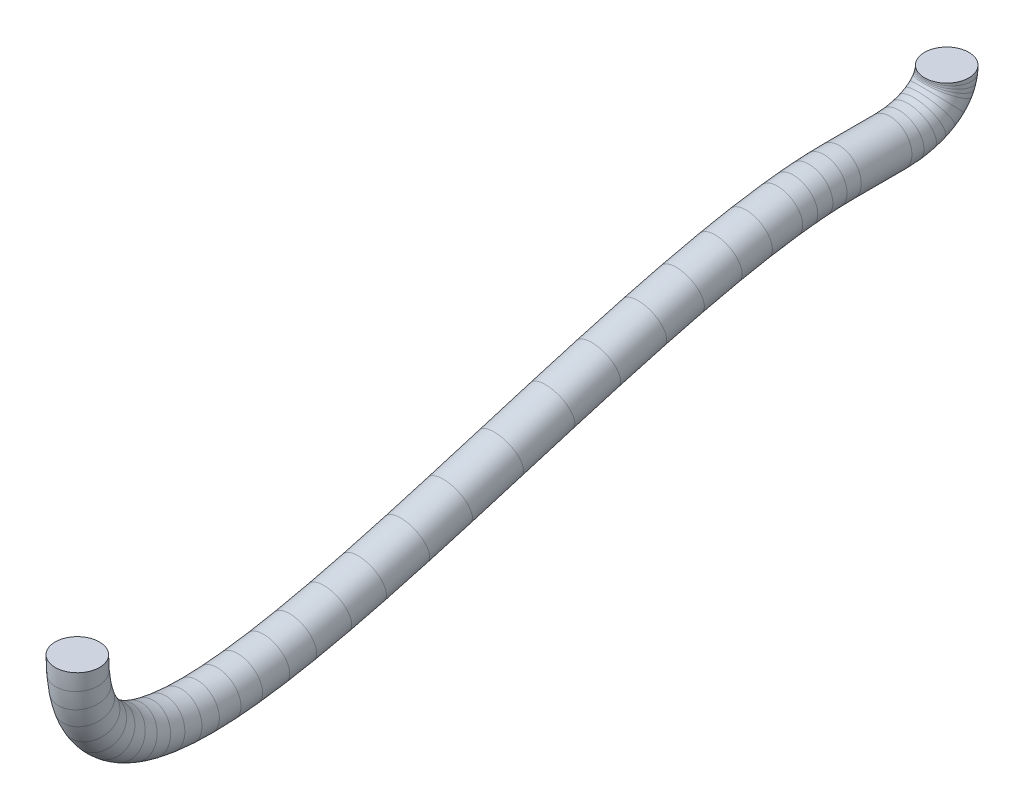
ISO-10303-21;
HEADER;
FILE_DESCRIPTION(('STEP AP214'),'2;1');
FILE_NAME('part.step','',(''),(''),'','','');
FILE_SCHEMA(('AUTOMOTIVE_DESIGN { 1 0 10303 214 1 1 1 1 }'));
ENDSEC;
DATA;
#1=APPLICATION_CONTEXT('core data for automotive mechanical design processes');
#2=APPLICATION_PROTOCOL_DEFINITION('international standard','automotive_design',2000,#1);
#3=PRODUCT_CONTEXT('',#1,'mechanical');
#4=PRODUCT('Part','Part','',(#3));
#5=PRODUCT_RELATED_PRODUCT_CATEGORY('part','',(#4));
#6=PRODUCT_DEFINITION_FORMATION('','',#4);
#7=PRODUCT_DEFINITION_CONTEXT('part definition',#1,'design');
#8=PRODUCT_DEFINITION('design','',#6,#7);
#9=PRODUCT_DEFINITION_SHAPE('','',#8);
#10=(LENGTH_UNIT() NAMED_UNIT(*) SI_UNIT(.MILLI.,.METRE.));
#11=(NAMED_UNIT(*) PLANE_ANGLE_UNIT() SI_UNIT($,.RADIAN.));
#12=(NAMED_UNIT(*) SI_UNIT($,.STERADIAN.) SOLID_ANGLE_UNIT());
#13=UNCERTAINTY_MEASURE_WITH_UNIT(LENGTH_MEASURE(1.E-05),#10,'distance_accuracy_value','');
#14=(GEOMETRIC_REPRESENTATION_CONTEXT(3) GLOBAL_UNCERTAINTY_ASSIGNED_CONTEXT((#13)) GLOBAL_UNIT_ASSIGNED_CONTEXT((#10,
#11,#12)) REPRESENTATION_CONTEXT('',''));
#15=CARTESIAN_POINT('',(0.,0.,0.));
#16=DIRECTION('',(0.,0.,1.));
#17=DIRECTION('',(1.,0.,0.));
#18=AXIS2_PLACEMENT_3D('',#15,#16,#17);
#19=CARTESIAN_POINT('',(-4.25000000000187,-230.95,225.510489149716));
#20=DIRECTION('',(0.,-1.,0.));
#21=DIRECTION('',(0.,0.,-1.));
#22=AXIS2_PLACEMENT_3D('',#19,#20,#21);
#23=PLANE('',#22);
#24=CARTESIAN_POINT('',(-4.25000000000187,-230.95,225.510489149716));
#25=DIRECTION('',(0.,1.,0.));
#26=DIRECTION('',(0.,0.,-1.));
#27=AXIS2_PLACEMENT_3D('',#24,#25,#26);
#28=CIRCLE('',#27,1.75);
#29=CARTESIAN_POINT('',(-4.25000000000187,-230.95,223.760489149716));
#30=VERTEX_POINT('',#29);
#31=EDGE_CURVE('E11',#30,#30,#28,.T.);
#32=ORIENTED_EDGE('',*,*,#31,.T.);
#33=EDGE_LOOP('',(#32));
#34=FACE_BOUND('',#33,.T.);
#35=ADVANCED_FACE('F42',(#34),#23,.F.);
#36=CARTESIAN_POINT('',(-4.25000000000187,-230.949999999997,211.445704661822));
#37=DIRECTION('',(1.,0.,0.));
#38=DIRECTION('',(0.,0.,1.));
#39=AXIS2_PLACEMENT_3D('',#36,#37,#38);
#40=TOROIDAL_SURFACE('',#39,14.0647844878944,1.75);
#41=ORIENTED_EDGE('',*,*,#31,.F.);
#42=EDGE_LOOP('',(#41));
#43=FACE_BOUND('',#42,.T.);
#44=CARTESIAN_POINT('',(-4.25000000000187,-232.154264746609,225.458838112659));
#45=DIRECTION('',(0.,0.996327633949824,0.0856226945847067));
#46=DIRECTION('',(0.,0.0856226945847067,-0.996327633949824));
#47=AXIS2_PLACEMENT_3D('',#44,#45,#46);
#48=CIRCLE('',#47,1.75);
#49=CARTESIAN_POINT('',(-4.25000000000187,-232.004425031085,223.715264753247));
#50=VERTEX_POINT('',#49);
#51=EDGE_CURVE('E53',#50,#50,#48,.T.);
#52=ORIENTED_EDGE('',*,*,#51,.T.);
#53=EDGE_LOOP('',(#52));
#54=FACE_BOUND('',#53,.T.);
#55=ADVANCED_FACE('F242',(#43,#54),#40,.T.);
#56=CARTESIAN_POINT('',(-4.25000000000199,-231.277167470841,215.252709261574));
#57=DIRECTION('',(-1.,0.,0.));
#58=DIRECTION('',(0.,0.,-1.));
#59=AXIS2_PLACEMENT_3D('',#56,#57,#58);
#60=TOROIDAL_SURFACE('',#59,10.2437476421527,1.75);
#61=CARTESIAN_POINT('',(-4.25000000000187,-233.346097740136,225.285350653397));
#62=DIRECTION('',(0.,0.97939169748172,0.20197005447312));
#63=DIRECTION('',(0.,0.20197005447312,-0.97939169748172));
#64=AXIS2_PLACEMENT_3D('',#61,#62,#63);
#65=CIRCLE('',#64,1.75);
#66=CARTESIAN_POINT('',(-4.25000000000187,-232.992650144808,223.571415182803));
#67=VERTEX_POINT('',#66);
#68=EDGE_CURVE('E208',#67,#67,#65,.T.);
#69=ORIENTED_EDGE('',*,*,#68,.T.);
#70=EDGE_LOOP('',(#69));
#71=FACE_BOUND('',#70,.T.);
#72=ORIENTED_EDGE('',*,*,#51,.F.);
#73=EDGE_LOOP('',(#72));
#74=FACE_BOUND('',#73,.T.);
#75=ADVANCED_FACE('F247',(#71,#74),#60,.T.);
#76=CARTESIAN_POINT('',(-4.25000000000187,-231.584241722187,216.741771454796));
#77=DIRECTION('',(-1.,0.,0.));
#78=DIRECTION('',(0.,1.,0.));
#79=AXIS2_PLACEMENT_3D('',#76,#77,#78);
#80=TOROIDAL_SURFACE('',#79,8.72335268980548,1.75);
#81=CARTESIAN_POINT('',(-4.25000000000187,-234.503096325618,224.962304889723));
#82=DIRECTION('',(0.,0.942359403229759,0.334602383650285));
#83=DIRECTION('',(0.,0.334602383650285,-0.942359403229759));
#84=AXIS2_PLACEMENT_3D('',#81,#82,#83);
#85=CIRCLE('',#84,1.75);
#86=CARTESIAN_POINT('',(-4.25000000000186,-233.91754215423,223.313175934071));
#87=VERTEX_POINT('',#86);
#88=EDGE_CURVE('E141',#87,#87,#85,.T.);
#89=ORIENTED_EDGE('',*,*,#88,.T.);
#90=EDGE_LOOP('',(#89));
#91=FACE_BOUND('',#90,.T.);
#92=ORIENTED_EDGE('',*,*,#68,.F.);
#93=EDGE_LOOP('',(#92));
#94=FACE_BOUND('',#93,.T.);
#95=ADVANCED_FACE('F411',(#91,#94),#80,.T.);
#96=CARTESIAN_POINT('',(-4.25000000000192,-232.255156456802,218.631306137818));
#97=DIRECTION('',(-1.,0.,0.));
#98=DIRECTION('',(0.,0.,-1.));
#99=AXIS2_PLACEMENT_3D('',#96,#97,#98);
#100=TOROIDAL_SURFACE('',#99,6.71824224410275,1.75);
#101=CARTESIAN_POINT('',(-4.25000000000187,-235.592941489095,224.461740935381));
#102=DIRECTION('',(0.,0.867851230384199,0.496824155935107));
#103=DIRECTION('',(0.,0.496824155935107,-0.867851230384199));
#104=AXIS2_PLACEMENT_3D('',#101,#102,#103);
#105=CIRCLE('',#104,1.75);
#106=CARTESIAN_POINT('',(-4.25000000000187,-234.723499216209,222.943001282209));
#107=VERTEX_POINT('',#106);
#108=EDGE_CURVE('E133',#107,#107,#105,.T.);
#109=ORIENTED_EDGE('',*,*,#108,.T.);
#110=EDGE_LOOP('',(#109));
#111=FACE_BOUND('',#110,.T.);
#112=ORIENTED_EDGE('',*,*,#88,.F.);
#113=EDGE_LOOP('',(#112));
#114=FACE_BOUND('',#113,.T.);
#115=ADVANCED_FACE('F413',(#111,#114),#100,.T.);
#116=CARTESIAN_POINT('',(-4.25000000000187,-232.535257527852,219.120586009259));
#117=DIRECTION('',(-1.,0.,0.));
#118=DIRECTION('',(0.,1.,0.));
#119=AXIS2_PLACEMENT_3D('',#116,#117,#118);
#120=TOROIDAL_SURFACE('',#119,6.15445912746987,1.75);
#121=CARTESIAN_POINT('',(-4.25000000000188,-236.504884638056,223.823715579836));
#122=DIRECTION('',(0.,0.76418243637133,0.645000158094227));
#123=DIRECTION('',(0.,0.645000158094227,-0.76418243637133));
#124=AXIS2_PLACEMENT_3D('',#121,#122,#123);
#125=CIRCLE('',#124,1.75);
#126=CARTESIAN_POINT('',(-4.25000000000187,-235.376134361391,222.486396316186));
#127=VERTEX_POINT('',#126);
#128=EDGE_CURVE('E46',#127,#127,#125,.T.);
#129=ORIENTED_EDGE('',*,*,#128,.T.);
#130=EDGE_LOOP('',(#129));
#131=FACE_BOUND('',#130,.T.);
#132=ORIENTED_EDGE('',*,*,#108,.F.);
#133=EDGE_LOOP('',(#132));
#134=FACE_BOUND('',#133,.T.);
#135=ADVANCED_FACE('F44',(#131,#134),#120,.T.);
#136=CARTESIAN_POINT('',(-4.25000000000193,-232.617301362329,219.217789795226));
#137=DIRECTION('',(-1.,0.,0.));
#138=DIRECTION('',(0.,0.,-1.));
#139=AXIS2_PLACEMENT_3D('',#136,#137,#138);
#140=TOROIDAL_SURFACE('',#139,6.02725941527647,1.75);
#141=CARTESIAN_POINT('',(-4.25000000000188,-237.285365654283,223.030535764369));
#142=DIRECTION('',(0.,0.632583684630803,0.774492015413276));
#143=DIRECTION('',(0.,0.774492015413276,-0.632583684630802));
#144=AXIS2_PLACEMENT_3D('',#141,#142,#143);
#145=CIRCLE('',#144,1.75);
#146=CARTESIAN_POINT('',(-4.25000000000188,-235.93000462731,221.923514316265));
#147=VERTEX_POINT('',#146);
#148=EDGE_CURVE('E203',#147,#147,#145,.T.);
#149=ORIENTED_EDGE('',*,*,#148,.T.);
#150=EDGE_LOOP('',(#149));
#151=FACE_BOUND('',#150,.T.);
#152=ORIENTED_EDGE('',*,*,#128,.F.);
#153=EDGE_LOOP('',(#152));
#154=FACE_BOUND('',#153,.T.);
#155=ADVANCED_FACE('F426',(#151,#154),#140,.T.);
#156=CARTESIAN_POINT('',(-4.25000000000188,-232.303168183887,218.961214492284));
#157=DIRECTION('',(-1.,0.,0.));
#158=DIRECTION('',(0.,0.,-1.));
#159=AXIS2_PLACEMENT_3D('',#156,#157,#158);
#160=TOROIDAL_SURFACE('',#159,6.43285840427552,1.75);
#161=CARTESIAN_POINT('',(-4.25000000000188,-237.922658876016,222.09218744179));
#162=DIRECTION('',(0.,0.486715663976958,0.873560451508348));
#163=DIRECTION('',(0.,0.873560451508348,-0.486715663976958));
#164=AXIS2_PLACEMENT_3D('',#161,#162,#163);
#165=CIRCLE('',#164,1.75);
#166=CARTESIAN_POINT('',(-4.25000000000188,-236.393928085876,221.240435029831));
#167=VERTEX_POINT('',#166);
#168=EDGE_CURVE('E200',#167,#167,#165,.T.);
#169=ORIENTED_EDGE('',*,*,#168,.T.);
#170=EDGE_LOOP('',(#169));
#171=FACE_BOUND('',#170,.T.);
#172=ORIENTED_EDGE('',*,*,#148,.F.);
#173=EDGE_LOOP('',(#172));
#174=FACE_BOUND('',#173,.T.);
#175=ADVANCED_FACE('F238',(#171,#174),#160,.T.);
#176=CARTESIAN_POINT('',(-4.25000000000188,-230.891977966949,218.174951352456));
#177=DIRECTION('',(-1.,0.,0.));
#178=DIRECTION('',(0.,0.,-1.));
#179=AXIS2_PLACEMENT_3D('',#176,#177,#178);
#180=TOROIDAL_SURFACE('',#179,8.04830495351097,1.75);
#181=CARTESIAN_POINT('',(-4.25000000000189,-238.404117197953,221.063372512659));
#182=DIRECTION('',(0.,0.358885650691737,0.933381534918904));
#183=DIRECTION('',(0.,0.933381534918904,-0.358885650691737));
#184=AXIS2_PLACEMENT_3D('',#181,#182,#183);
#185=CIRCLE('',#184,1.75);
#186=CARTESIAN_POINT('',(-4.25000000000188,-236.770699511845,220.435322623949));
#187=VERTEX_POINT('',#186);
#188=EDGE_CURVE('E191',#187,#187,#185,.T.);
#189=ORIENTED_EDGE('',*,*,#188,.T.);
#190=EDGE_LOOP('',(#189));
#191=FACE_BOUND('',#190,.T.);
#192=ORIENTED_EDGE('',*,*,#168,.F.);
#193=EDGE_LOOP('',(#192));
#194=FACE_BOUND('',#193,.T.);
#195=ADVANCED_FACE('F224',(#191,#194),#180,.T.);
#196=CARTESIAN_POINT('',(-4.2500000000019,-229.650055569719,217.697431591275));
#197=DIRECTION('',(-1.,0.,0.));
#198=DIRECTION('',(0.,0.,-1.));
#199=AXIS2_PLACEMENT_3D('',#196,#197,#198);
#200=TOROIDAL_SURFACE('',#199,9.37886737709676,1.75);
#201=CARTESIAN_POINT('',(-4.2500000000019,-238.75714237465,219.938887190796));
#202=DIRECTION('',(0.,0.238990009069875,0.971022026302587));
#203=DIRECTION('',(0.,0.971022026302586,-0.238990009069875));
#204=AXIS2_PLACEMENT_3D('',#201,#202,#203);
#205=CIRCLE('',#204,1.75);
#206=CARTESIAN_POINT('',(-4.25000000000189,-237.057853828621,219.520654674924));
#207=VERTEX_POINT('',#206);
#208=EDGE_CURVE('E185',#207,#207,#205,.T.);
#209=ORIENTED_EDGE('',*,*,#208,.T.);
#210=EDGE_LOOP('',(#209));
#211=FACE_BOUND('',#210,.T.);
#212=ORIENTED_EDGE('',*,*,#188,.F.);
#213=EDGE_LOOP('',(#212));
#214=FACE_BOUND('',#213,.T.);
#215=ADVANCED_FACE('F229',(#211,#214),#200,.T.);
#216=CARTESIAN_POINT('',(-4.25000000000169,-226.243998497161,216.859125570808));
#217=DIRECTION('',(-1.,0.,0.));
#218=DIRECTION('',(0.,1.,0.));
#219=AXIS2_PLACEMENT_3D('',#216,#217,#218);
#220=TOROIDAL_SURFACE('',#219,12.8865705808288,1.75);
#221=CARTESIAN_POINT('',(-4.25000000000191,-238.986349474261,218.78167411664));
#222=DIRECTION('',(0.,0.149190083876609,0.988808534991932));
#223=DIRECTION('',(0.,0.988808534991932,-0.149190083876609));
#224=AXIS2_PLACEMENT_3D('',#221,#222,#223);
#225=CIRCLE('',#224,1.75);
#226=CARTESIAN_POINT('',(-4.2500000000019,-237.255934538026,218.520591469856));
#227=VERTEX_POINT('',#226);
#228=EDGE_CURVE('E180',#227,#227,#225,.T.);
#229=ORIENTED_EDGE('',*,*,#228,.T.);
#230=EDGE_LOOP('',(#229));
#231=FACE_BOUND('',#230,.T.);
#232=ORIENTED_EDGE('',*,*,#208,.F.);
#233=EDGE_LOOP('',(#232));
#234=FACE_BOUND('',#233,.T.);
#235=ADVANCED_FACE('F181',(#231,#234),#220,.T.);
#236=CARTESIAN_POINT('',(-4.25000000000191,-223.881282764538,216.502642241779));
#237=DIRECTION('',(-1.,0.,0.));
#238=DIRECTION('',(0.,0.,-1.));
#239=AXIS2_PLACEMENT_3D('',#236,#237,#238);
#240=TOROIDAL_SURFACE('',#239,15.2760278407654,1.75);
#241=CARTESIAN_POINT('',(-4.25000000000191,-239.130219889069,217.412006395438));
#242=DIRECTION('',(0.,0.0595288358428146,0.998226586353619));
#243=DIRECTION('',(0.,0.998226586353619,-0.0595288358428146));
#244=AXIS2_PLACEMENT_3D('',#241,#242,#243);
#245=CIRCLE('',#244,1.75);
#246=CARTESIAN_POINT('',(-4.2500000000019,-237.38332336295,217.307830932713));
#247=VERTEX_POINT('',#246);
#248=EDGE_CURVE('E174',#247,#247,#245,.T.);
#249=ORIENTED_EDGE('',*,*,#248,.T.);
#250=EDGE_LOOP('',(#249));
#251=FACE_BOUND('',#250,.T.);
#252=ORIENTED_EDGE('',*,*,#228,.F.);
#253=EDGE_LOOP('',(#252));
#254=FACE_BOUND('',#253,.T.);
#255=ADVANCED_FACE('F237',(#251,#254),#240,.T.);
#256=CARTESIAN_POINT('',(-4.25000000000192,-217.547988332925,216.124958808258));
#257=DIRECTION('',(-1.,0.,0.));
#258=DIRECTION('',(0.,0.,-1.));
#259=AXIS2_PLACEMENT_3D('',#256,#257,#258);
#260=TOROIDAL_SURFACE('',#259,21.6205737767215,1.75);
#261=CARTESIAN_POINT('',(-4.25000000000192,-239.168373417637,216.034630388392));
#262=DIRECTION('',(0.,-0.00417789189117408,0.999991272571589));
#263=DIRECTION('',(0.,0.999991272571589,0.00417789189117408));
#264=AXIS2_PLACEMENT_3D('',#261,#262,#263);
#265=CIRCLE('',#264,1.75);
#266=CARTESIAN_POINT('',(-4.25000000000191,-237.418388690636,216.041941699202));
#267=VERTEX_POINT('',#266);
#268=EDGE_CURVE('E194',#267,#267,#265,.T.);
#269=ORIENTED_EDGE('',*,*,#268,.T.);
#270=EDGE_LOOP('',(#269));
#271=FACE_BOUND('',#270,.T.);
#272=ORIENTED_EDGE('',*,*,#248,.F.);
#273=EDGE_LOOP('',(#272));
#274=FACE_BOUND('',#273,.T.);
#275=ADVANCED_FACE('F287',(#271,#274),#260,.T.);
#276=CARTESIAN_POINT('',(-4.25000000000152,-213.387296329698,216.14234188136));
#277=DIRECTION('',(-1.,0.,0.));
#278=DIRECTION('',(0.,1.,0.));
#279=AXIS2_PLACEMENT_3D('',#276,#277,#278);
#280=TOROIDAL_SURFACE('',#279,25.7813020924076,1.75);
#281=CARTESIAN_POINT('',(-4.25000000000192,-239.104795176421,214.329666883253));
#282=DIRECTION('',(0.,-0.0703096760434108,0.997525212440603));
#283=DIRECTION('',(0.,0.997525212440603,0.0703096760434108));
#284=AXIS2_PLACEMENT_3D('',#281,#282,#283);
#285=CIRCLE('',#284,1.75);
#286=CARTESIAN_POINT('',(-4.25000000000192,-237.359126054649,214.452708816329));
#287=VERTEX_POINT('',#286);
#288=EDGE_CURVE('E295',#287,#287,#285,.T.);
#289=ORIENTED_EDGE('',*,*,#288,.T.);
#290=EDGE_LOOP('',(#289));
#291=FACE_BOUND('',#290,.T.);
#292=ORIENTED_EDGE('',*,*,#268,.F.);
#293=EDGE_LOOP('',(#292));
#294=FACE_BOUND('',#293,.T.);
#295=ADVANCED_FACE('F278',(#291,#294),#280,.T.);
#296=CARTESIAN_POINT('',(-4.25000000000193,-202.110518557893,216.93717551768));
#297=DIRECTION('',(-1.,0.,0.));
#298=DIRECTION('',(0.,0.,-1.));
#299=AXIS2_PLACEMENT_3D('',#296,#297,#298);
#300=TOROIDAL_SURFACE('',#299,37.0860567303507,1.75);
#301=CARTESIAN_POINT('',(-4.25000000000194,-238.945663426273,212.630470706317));
#302=DIRECTION('',(0.,-0.116127331700109,0.993234334299924));
#303=DIRECTION('',(0.,0.993234334299924,0.116127331700109));
#304=AXIS2_PLACEMENT_3D('',#301,#302,#303);
#305=CIRCLE('',#304,1.75);
#306=CARTESIAN_POINT('',(-4.25000000000192,-237.207503341248,212.833693536792));
#307=VERTEX_POINT('',#306);
#308=EDGE_CURVE('E293',#307,#307,#305,.T.);
#309=ORIENTED_EDGE('',*,*,#308,.T.);
#310=EDGE_LOOP('',(#309));
#311=FACE_BOUND('',#310,.T.);
#312=ORIENTED_EDGE('',*,*,#288,.F.);
#313=EDGE_LOOP('',(#312));
#314=FACE_BOUND('',#313,.T.);
#315=ADVANCED_FACE('F275',(#311,#314),#300,.T.);
#316=CARTESIAN_POINT('',(-4.25000000000194,-194.742283808802,217.79865745723));
#317=DIRECTION('',(-1.,0.,0.));
#318=DIRECTION('',(0.,0.,-1.));
#319=AXIS2_PLACEMENT_3D('',#316,#317,#318);
#320=TOROIDAL_SURFACE('',#319,44.5044820652765,1.75);
#321=CARTESIAN_POINT('',(-4.25000000000195,-238.644029136113,210.498953277301));
#322=DIRECTION('',(0.,-0.164021775812269,0.986456718289956));
#323=DIRECTION('',(0.,0.986456718289956,0.164021775812269));
#324=AXIS2_PLACEMENT_3D('',#321,#322,#323);
#325=CIRCLE('',#324,1.75);
#326=CARTESIAN_POINT('',(-4.25000000000193,-236.917729879106,210.785991384972));
#327=VERTEX_POINT('',#326);
#328=EDGE_CURVE('E304',#327,#327,#325,.T.);
#329=ORIENTED_EDGE('',*,*,#328,.T.);
#330=EDGE_LOOP('',(#329));
#331=FACE_BOUND('',#330,.T.);
#332=ORIENTED_EDGE('',*,*,#308,.F.);
#333=EDGE_LOOP('',(#332));
#334=FACE_BOUND('',#333,.T.);
#335=ADVANCED_FACE('F277',(#331,#334),#320,.T.);
#336=CARTESIAN_POINT('',(-4.25000000000359,-174.11323986088,221.228724239613));
#337=DIRECTION('',(-1.,0.,0.));
#338=DIRECTION('',(0.,1.,0.));
#339=AXIS2_PLACEMENT_3D('',#336,#337,#338);
#340=TOROIDAL_SURFACE('',#339,65.4167467044053,1.75);
#341=CARTESIAN_POINT('',(-4.25000000000196,-238.255969944217,208.381120305632));
#342=DIRECTION('',(0.,-0.196396252966224,0.98052461051257));
#343=DIRECTION('',(0.,0.98052461051257,0.196396252966224));
#344=AXIS2_PLACEMENT_3D('',#341,#342,#343);
#345=CIRCLE('',#344,1.75);
#346=CARTESIAN_POINT('',(-4.25000000000194,-236.54005187582,208.724813748323));
#347=VERTEX_POINT('',#346);
#348=EDGE_CURVE('E337',#347,#347,#345,.T.);
#349=ORIENTED_EDGE('',*,*,#348,.T.);
#350=EDGE_LOOP('',(#349));
#351=FACE_BOUND('',#350,.T.);
#352=ORIENTED_EDGE('',*,*,#328,.F.);
#353=EDGE_LOOP('',(#352));
#354=FACE_BOUND('',#353,.T.);
#355=ADVANCED_FACE('F284',(#351,#354),#340,.T.);
#356=CARTESIAN_POINT('',(-4.25000000000196,-159.723228065321,224.111002120732));
#357=DIRECTION('',(-1.,0.,0.));
#358=DIRECTION('',(0.,0.,-1.));
#359=AXIS2_PLACEMENT_3D('',#356,#357,#358);
#360=TOROIDAL_SURFACE('',#359,80.0925759913752,1.75);
#361=CARTESIAN_POINT('',(-4.25000000000196,-237.652659422165,205.622506851156));
#362=DIRECTION('',(0.,-0.230839063930052,0.972991945785728));
#363=DIRECTION('',(0.,0.972991945785728,0.230839063930052));
#364=AXIS2_PLACEMENT_3D('',#361,#362,#363);
#365=CIRCLE('',#364,1.75);
#366=CARTESIAN_POINT('',(-4.25000000000195,-235.94992351704,206.026475213034));
#367=VERTEX_POINT('',#366);
#368=EDGE_CURVE('E216',#367,#367,#365,.T.);
#369=ORIENTED_EDGE('',*,*,#368,.T.);
#370=EDGE_LOOP('',(#369));
#371=FACE_BOUND('',#370,.T.);
#372=ORIENTED_EDGE('',*,*,#348,.F.);
#373=EDGE_LOOP('',(#372));
#374=FACE_BOUND('',#373,.T.);
#375=ADVANCED_FACE('F528',(#371,#374),#360,.T.);
#376=CARTESIAN_POINT('',(-4.25000000000197,-114.101961776169,234.934493981204));
#377=DIRECTION('',(-1.,0.,0.));
#378=DIRECTION('',(0.,0.,-1.));
#379=AXIS2_PLACEMENT_3D('',#376,#377,#378);
#380=TOROIDAL_SURFACE('',#379,126.980185376793,1.75);
#381=CARTESIAN_POINT('',(-4.25000000000198,-236.970235854658,202.882119602728));
#382=DIRECTION('',(0.,-0.252420283395877,0.967617693373961));
#383=DIRECTION('',(0.,0.967617693373961,0.252420283395877));
#384=AXIS2_PLACEMENT_3D('',#381,#382,#383);
#385=CIRCLE('',#384,1.75);
#386=CARTESIAN_POINT('',(-4.25000000000197,-235.276904891253,203.323855098671));
#387=VERTEX_POINT('',#386);
#388=EDGE_CURVE('E214',#387,#387,#385,.T.);
#389=ORIENTED_EDGE('',*,*,#388,.T.);
#390=EDGE_LOOP('',(#389));
#391=FACE_BOUND('',#390,.T.);
#392=ORIENTED_EDGE('',*,*,#368,.F.);
#393=EDGE_LOOP('',(#392));
#394=FACE_BOUND('',#393,.T.);
#395=ADVANCED_FACE('F461',(#391,#394),#380,.T.);
#396=CARTESIAN_POINT('',(-4.2499999999981,-77.7247518364724,244.424136125106));
#397=DIRECTION('',(-1.,0.,0.));
#398=DIRECTION('',(0.,1.,0.));
#399=AXIS2_PLACEMENT_3D('',#396,#397,#398);
#400=TOROIDAL_SURFACE('',#399,164.574795509311,1.75);
#401=CARTESIAN_POINT('',(-4.25000000000199,-236.04549732986,199.486347312689));
#402=DIRECTION('',(0.,-0.273053894268858,0.961998737434001));
#403=DIRECTION('',(0.,0.961998737434001,0.273053894268858));
#404=AXIS2_PLACEMENT_3D('',#401,#402,#403);
#405=CIRCLE('',#404,1.75);
#406=CARTESIAN_POINT('',(-4.25000000000198,-234.361999539351,199.964191627659));
#407=VERTEX_POINT('',#406);
#408=EDGE_CURVE('E217',#407,#407,#405,.T.);
#409=ORIENTED_EDGE('',*,*,#408,.T.);
#410=EDGE_LOOP('',(#409));
#411=FACE_BOUND('',#410,.T.);
#412=ORIENTED_EDGE('',*,*,#388,.F.);
#413=EDGE_LOOP('',(#412));
#414=FACE_BOUND('',#413,.T.);
#415=ADVANCED_FACE('F457',(#411,#414),#400,.T.);
#416=CARTESIAN_POINT('',(-4.250000000002,89.1154384764909,291.780085683751));
#417=DIRECTION('',(-1.,0.,0.));
#418=DIRECTION('',(0.,0.,-1.));
#419=AXIS2_PLACEMENT_3D('',#416,#417,#418);
#420=TOROIDAL_SURFACE('',#419,338.005574387418,1.75);
#421=CARTESIAN_POINT('',(-4.25000000000201,-235.06684543233,196.105558683984));
#422=DIRECTION('',(0.,-0.283056062531411,0.95910336537008));
#423=DIRECTION('',(0.,0.95910336537008,0.283056062531411));
#424=AXIS2_PLACEMENT_3D('',#421,#422,#423);
#425=CIRCLE('',#424,1.75);
#426=CARTESIAN_POINT('',(-4.250000000002,-233.388414542932,196.600906793413));
#427=VERTEX_POINT('',#426);
#428=EDGE_CURVE('E355',#427,#427,#425,.T.);
#429=ORIENTED_EDGE('',*,*,#428,.T.);
#430=EDGE_LOOP('',(#429));
#431=FACE_BOUND('',#430,.T.);
#432=ORIENTED_EDGE('',*,*,#408,.F.);
#433=EDGE_LOOP('',(#432));
#434=FACE_BOUND('',#433,.T.);
#435=ADVANCED_FACE('F460',(#431,#434),#420,.T.);
#436=CARTESIAN_POINT('',(-4.25000000000202,355.624618688653,370.433796955109));
#437=DIRECTION('',(-1.,0.,0.));
#438=DIRECTION('',(0.,0.,-1.));
#439=AXIS2_PLACEMENT_3D('',#436,#437,#438);
#440=TOROIDAL_SURFACE('',#439,615.878835846877,1.75);
#441=CARTESIAN_POINT('',(-4.25000000000203,-233.857534134273,192.059101587878));
#442=DIRECTION('',(0.,-0.28962627871776,0.957139811457084));
#443=DIRECTION('',(0.,0.957139811457084,0.28962627871776));
#444=AXIS2_PLACEMENT_3D('',#441,#442,#443);
#445=CIRCLE('',#444,1.75);
#446=CARTESIAN_POINT('',(-4.25000000000201,-232.182539464223,192.565947575634));
#447=VERTEX_POINT('',#446);
#448=EDGE_CURVE('E350',#447,#447,#445,.T.);
#449=ORIENTED_EDGE('',*,*,#448,.T.);
#450=EDGE_LOOP('',(#449));
#451=FACE_BOUND('',#450,.T.);
#452=ORIENTED_EDGE('',*,*,#428,.F.);
#453=EDGE_LOOP('',(#452));
#454=FACE_BOUND('',#453,.T.);
#455=ADVANCED_FACE('F273',(#451,#454),#440,.T.);
#456=CARTESIAN_POINT('',(-4.2499999999175,-1115.67701243899,-74.7755770466804));
#457=DIRECTION('',(1.,0.,0.));
#458=DIRECTION('',(0.,-1.,0.));
#459=AXIS2_PLACEMENT_3D('',#456,#457,#458);
#460=TOROIDAL_SURFACE('',#459,921.306864209537,1.75);
#461=CARTESIAN_POINT('',(-4.25000000000204,-232.643620231672,188.014008527878));
#462=DIRECTION('',(0.,-0.285235675307392,0.958457411433568));
#463=DIRECTION('',(0.,0.958457411433568,0.285235675307392));
#464=AXIS2_PLACEMENT_3D('',#461,#462,#463);
#465=CIRCLE('',#464,1.75);
#466=CARTESIAN_POINT('',(-4.25000000000203,-230.966319761663,188.513170959666));
#467=VERTEX_POINT('',#466);
#468=EDGE_CURVE('E346',#467,#467,#465,.T.);
#469=ORIENTED_EDGE('',*,*,#468,.T.);
#470=EDGE_LOOP('',(#469));
#471=FACE_BOUND('',#470,.T.);
#472=ORIENTED_EDGE('',*,*,#448,.F.);
#473=EDGE_LOOP('',(#472));
#474=FACE_BOUND('',#473,.T.);
#475=ADVANCED_FACE('F270',(#471,#474),#460,.T.);
#476=CARTESIAN_POINT('',(-4.25000000000205,-641.725473173931,66.2717827508286));
#477=DIRECTION('',(1.,0.,0.));
#478=DIRECTION('',(0.,0.,1.));
#479=AXIS2_PLACEMENT_3D('',#476,#477,#478);
#480=TOROIDAL_SURFACE('',#479,426.812759818426,1.75);
#481=CARTESIAN_POINT('',(-4.25000000000205,-231.58113500926,184.385091972468));
#482=DIRECTION('',(0.,-0.276733313388889,0.960946758806546));
#483=DIRECTION('',(0.,0.960946758806546,0.276733313388889));
#484=AXIS2_PLACEMENT_3D('',#481,#482,#483);
#485=CIRCLE('',#484,1.75);
#486=CARTESIAN_POINT('',(-4.25000000000204,-229.899478181349,184.869375270899));
#487=VERTEX_POINT('',#486);
#488=EDGE_CURVE('E351',#487,#487,#485,.T.);
#489=ORIENTED_EDGE('',*,*,#488,.T.);
#490=EDGE_LOOP('',(#489));
#491=FACE_BOUND('',#490,.T.);
#492=ORIENTED_EDGE('',*,*,#468,.F.);
#493=EDGE_LOOP('',(#492));
#494=FACE_BOUND('',#493,.T.);
#495=ADVANCED_FACE('F272',(#491,#494),#480,.T.);
#496=CARTESIAN_POINT('',(-4.24999999999743,-417.149501155132,130.945139807377));
#497=DIRECTION('',(1.,0.,0.));
#498=DIRECTION('',(0.,-1.,0.));
#499=AXIS2_PLACEMENT_3D('',#496,#497,#498);
#500=TOROIDAL_SURFACE('',#499,193.109935014891,1.75);
#501=CARTESIAN_POINT('',(-4.25000000000207,-230.570396712221,180.741573281437));
#502=DIRECTION('',(0.,-0.257865725396845,0.96618076345245));
#503=DIRECTION('',(0.,0.96618076345245,0.257865725396845));
#504=AXIS2_PLACEMENT_3D('',#501,#502,#503);
#505=CIRCLE('',#504,1.75);
#506=CARTESIAN_POINT('',(-4.25000000000205,-228.879580376179,181.192838300881));
#507=VERTEX_POINT('',#506);
#508=EDGE_CURVE('E307',#507,#507,#505,.T.);
#509=ORIENTED_EDGE('',*,*,#508,.T.);
#510=EDGE_LOOP('',(#509));
#511=FACE_BOUND('',#510,.T.);
#512=ORIENTED_EDGE('',*,*,#488,.F.);
#513=EDGE_LOOP('',(#512));
#514=FACE_BOUND('',#513,.T.);
#515=ADVANCED_FACE('F252',(#511,#514),#500,.T.);
#516=CARTESIAN_POINT('',(-4.25000000000207,-373.950300428868,142.47465235141));
#517=DIRECTION('',(1.,0.,0.));
#518=DIRECTION('',(0.,0.,1.));
#519=AXIS2_PLACEMENT_3D('',#516,#517,#518);
#520=TOROIDAL_SURFACE('',#519,148.398632161014,1.75);
#521=CARTESIAN_POINT('',(-4.25000000000207,-229.807377478257,177.75881013524));
#522=DIRECTION('',(0.,-0.237766058016081,0.97132244988752));
#523=DIRECTION('',(0.,0.97132244988752,0.237766058016081));
#524=AXIS2_PLACEMENT_3D('',#521,#522,#523);
#525=CIRCLE('',#524,1.75);
#526=CARTESIAN_POINT('',(-4.25000000000206,-228.107563190954,178.174900736768));
#527=VERTEX_POINT('',#526);
#528=EDGE_CURVE('E212',#527,#527,#525,.T.);
#529=ORIENTED_EDGE('',*,*,#528,.T.);
#530=EDGE_LOOP('',(#529));
#531=FACE_BOUND('',#530,.T.);
#532=ORIENTED_EDGE('',*,*,#508,.F.);
#533=EDGE_LOOP('',(#532));
#534=FACE_BOUND('',#533,.T.);
#535=ADVANCED_FACE('F836',(#531,#534),#520,.T.);
#536=CARTESIAN_POINT('',(-4.25000000000207,-321.794207543906,155.241729451397));
#537=DIRECTION('',(1.,0.,0.));
#538=DIRECTION('',(0.,0.,1.));
#539=AXIS2_PLACEMENT_3D('',#536,#537,#538);
#540=TOROIDAL_SURFACE('',#539,94.7026706489815,1.75);
#541=CARTESIAN_POINT('',(-4.25000000000208,-229.124098525202,174.757024030546));
#542=DIRECTION('',(0.,-0.206069104972166,0.978537441274461));
#543=DIRECTION('',(0.,0.978537441274461,0.206069104972166));
#544=AXIS2_PLACEMENT_3D('',#541,#542,#543);
#545=CIRCLE('',#544,1.75);
#546=CARTESIAN_POINT('',(-4.25000000000207,-227.411658002972,175.117644964247));
#547=VERTEX_POINT('',#546);
#548=EDGE_CURVE('E209',#547,#547,#545,.T.);
#549=ORIENTED_EDGE('',*,*,#548,.T.);
#550=EDGE_LOOP('',(#549));
#551=FACE_BOUND('',#550,.T.);
#552=ORIENTED_EDGE('',*,*,#528,.F.);
#553=EDGE_LOOP('',(#552));
#554=FACE_BOUND('',#553,.T.);
#555=ADVANCED_FACE('F454',(#551,#554),#540,.T.);
#556=CARTESIAN_POINT('',(-4.25000000000027,-305.384304177313,158.697472642044));
#557=DIRECTION('',(1.,0.,0.));
#558=DIRECTION('',(0.,-1.,0.));
#559=AXIS2_PLACEMENT_3D('',#556,#557,#558);
#560=TOROIDAL_SURFACE('',#559,77.9328438907639,1.75);
#561=CARTESIAN_POINT('',(-4.25000000000209,-228.658737258291,172.361862048697));
#562=DIRECTION('',(0.,-0.175335439135377,0.984508752517317));
#563=DIRECTION('',(0.,0.984508752517317,0.175335439135377));
#564=AXIS2_PLACEMENT_3D('',#561,#562,#563);
#565=CIRCLE('',#564,1.75);
#566=CARTESIAN_POINT('',(-4.25000000000207,-226.935846941385,172.668699067184));
#567=VERTEX_POINT('',#566);
#568=EDGE_CURVE('E213',#567,#567,#565,.T.);
#569=ORIENTED_EDGE('',*,*,#568,.T.);
#570=EDGE_LOOP('',(#569));
#571=FACE_BOUND('',#570,.T.);
#572=ORIENTED_EDGE('',*,*,#548,.F.);
#573=EDGE_LOOP('',(#572));
#574=FACE_BOUND('',#573,.T.);
#575=ADVANCED_FACE('F452',(#571,#574),#560,.T.);
#576=CARTESIAN_POINT('',(-4.25000000000209,-281.665797849901,162.921604435611));
#577=DIRECTION('',(1.,0.,0.));
#578=DIRECTION('',(0.,0.,1.));
#579=AXIS2_PLACEMENT_3D('',#576,#577,#578);
#580=TOROIDAL_SURFACE('',#579,53.8411268117981,1.75);
#581=CARTESIAN_POINT('',(-4.25000000000209,-228.285509846019,169.950956396267));
#582=DIRECTION('',(0.,-0.130557296566827,0.991440765912499));
#583=DIRECTION('',(0.,0.991440765912499,0.130557296566827));
#584=AXIS2_PLACEMENT_3D('',#581,#582,#583);
#585=CIRCLE('',#584,1.75);
#586=CARTESIAN_POINT('',(-4.25000000000207,-226.550488505673,170.179431665258));
#587=VERTEX_POINT('',#586);
#588=EDGE_CURVE('E309',#587,#587,#585,.T.);
#589=ORIENTED_EDGE('',*,*,#588,.T.);
#590=EDGE_LOOP('',(#589));
#591=FACE_BOUND('',#590,.T.);
#592=ORIENTED_EDGE('',*,*,#568,.F.);
#593=EDGE_LOOP('',(#592));
#594=FACE_BOUND('',#593,.T.);
#595=ADVANCED_FACE('F449',(#591,#594),#580,.T.);
#596=CARTESIAN_POINT('',(-4.25000000000209,-274.364382111561,163.883087090614));
#597=DIRECTION('',(1.,0.,0.));
#598=DIRECTION('',(0.,0.,1.));
#599=AXIS2_PLACEMENT_3D('',#596,#597,#598);
#600=TOROIDAL_SURFACE('',#599,46.4766770238004,1.75);
#601=CARTESIAN_POINT('',(-4.25000000000209,-228.144064286419,168.75789245262));
#602=DIRECTION('',(0.,-0.104887132087639,0.994484132363322));
#603=DIRECTION('',(0.,0.994484132363322,0.104887132087639));
#604=AXIS2_PLACEMENT_3D('',#601,#602,#603);
#605=CIRCLE('',#604,1.75);
#606=CARTESIAN_POINT('',(-4.25000000000208,-226.403717054783,168.941444933773));
#607=VERTEX_POINT('',#606);
#608=EDGE_CURVE('E311',#607,#607,#605,.T.);
#609=ORIENTED_EDGE('',*,*,#608,.T.);
#610=EDGE_LOOP('',(#609));
#611=FACE_BOUND('',#610,.T.);
#612=ORIENTED_EDGE('',*,*,#588,.F.);
#613=EDGE_LOOP('',(#612));
#614=FACE_BOUND('',#613,.T.);
#615=ADVANCED_FACE('F447',(#611,#614),#600,.T.);
#616=CARTESIAN_POINT('',(-4.25000000000032,-265.880395591307,164.77788368495));
#617=DIRECTION('',(1.,0.,0.));
#618=DIRECTION('',(0.,-1.,0.));
#619=AXIS2_PLACEMENT_3D('',#616,#617,#618);
#620=TOROIDAL_SURFACE('',#619,37.9456344016418,1.75);
#621=CARTESIAN_POINT('',(-4.25000000000209,-228.036984849377,167.561304882069));
#622=DIRECTION('',(0.,-0.0733528702570044,0.997306049527957));
#623=DIRECTION('',(0.,0.997306049527957,0.0733528702570044));
#624=AXIS2_PLACEMENT_3D('',#621,#622,#623);
#625=CIRCLE('',#624,1.75);
#626=CARTESIAN_POINT('',(-4.25000000000208,-226.291699262703,167.689672405019));
#627=VERTEX_POINT('',#626);
#628=EDGE_CURVE('E321',#627,#627,#625,.T.);
#629=ORIENTED_EDGE('',*,*,#628,.T.);
#630=EDGE_LOOP('',(#629));
#631=FACE_BOUND('',#630,.T.);
#632=ORIENTED_EDGE('',*,*,#608,.F.);
#633=EDGE_LOOP('',(#632));
#634=FACE_BOUND('',#633,.T.);
#635=ADVANCED_FACE('F443',(#631,#634),#620,.T.);
#636=CARTESIAN_POINT('',(-4.25000000000209,-262.210681003385,165.04779491045));
#637=DIRECTION('',(1.,0.,0.));
#638=DIRECTION('',(0.,0.,1.));
#639=AXIS2_PLACEMENT_3D('',#636,#637,#638);
#640=TOROIDAL_SURFACE('',#639,34.2660070799602,1.75);
#641=CARTESIAN_POINT('',(-4.25000000000209,-227.972831966545,166.436655787009));
#642=DIRECTION('',(0.,-0.0405317396118426,0.999178251406644));
#643=DIRECTION('',(0.,0.999178251406644,0.0405317396118426));
#644=AXIS2_PLACEMENT_3D('',#641,#642,#643);
#645=CIRCLE('',#644,1.75);
#646=CARTESIAN_POINT('',(-4.25000000000208,-226.224270026583,166.50758633133));
#647=VERTEX_POINT('',#646);
#648=EDGE_CURVE('E329',#647,#647,#645,.T.);
#649=ORIENTED_EDGE('',*,*,#648,.T.);
#650=EDGE_LOOP('',(#649));
#651=FACE_BOUND('',#650,.T.);
#652=ORIENTED_EDGE('',*,*,#628,.F.);
#653=EDGE_LOOP('',(#652));
#654=FACE_BOUND('',#653,.T.);
#655=ADVANCED_FACE('F446',(#651,#654),#640,.T.);
#656=CARTESIAN_POINT('',(-4.25000000000101,-255.734808680971,165.310489149871));
#657=DIRECTION('',(1.,0.,0.));
#658=DIRECTION('',(0.,-1.,0.));
#659=AXIS2_PLACEMENT_3D('',#656,#657,#658);
#660=TOROIDAL_SURFACE('',#659,27.7848088420089,1.75);
#661=CARTESIAN_POINT('',(-4.25000000000209,-227.949999838962,165.31048914986));
#662=DIRECTION('',(0.,0.,1.));
#663=DIRECTION('',(0.,1.,0.));
#664=AXIS2_PLACEMENT_3D('',#661,#662,#663);
#665=CIRCLE('',#664,1.75);
#666=CARTESIAN_POINT('',(-4.25000000000208,-226.199999838962,165.310489149859));
#667=VERTEX_POINT('',#666);
#668=EDGE_CURVE('E342',#667,#667,#665,.T.);
#669=ORIENTED_EDGE('',*,*,#668,.T.);
#670=EDGE_LOOP('',(#669));
#671=FACE_BOUND('',#670,.T.);
#672=ORIENTED_EDGE('',*,*,#648,.F.);
#673=EDGE_LOOP('',(#672));
#674=FACE_BOUND('',#673,.T.);
#675=ADVANCED_FACE('F463',(#671,#674),#660,.T.);
#676=CARTESIAN_POINT('',(-4.25000000000209,-224.94999983895,156.810489149858));
#677=DIRECTION('',(0.,1.,0.));
#678=DIRECTION('',(0.,0.,-1.));
#679=AXIS2_PLACEMENT_3D('',#676,#677,#678);
#680=PLANE('',#679);
#681=CARTESIAN_POINT('',(-4.25000000000209,-224.94999983895,156.810489149858));
#682=DIRECTION('',(0.,-1.,0.));
#683=DIRECTION('',(1.,0.,0.));
#684=AXIS2_PLACEMENT_3D('',#681,#682,#683);
#685=CIRCLE('',#684,1.75);
#686=CARTESIAN_POINT('',(-2.50000000000209,-224.94999983895,156.810489149858));
#687=VERTEX_POINT('',#686);
#688=EDGE_CURVE('E364',#687,#687,#685,.T.);
#689=ORIENTED_EDGE('',*,*,#688,.F.);
#690=EDGE_LOOP('',(#689));
#691=FACE_BOUND('',#690,.T.);
#692=ADVANCED_FACE('F257',(#691),#680,.T.);
#693=CARTESIAN_POINT('',(-4.25000000000209,-227.949999838949,161.310489149859));
#694=DIRECTION('',(0.,0.,1.));
#695=DIRECTION('',(-1.,0.,0.));
#696=AXIS2_PLACEMENT_3D('',#693,#694,#695);
#697=CYLINDRICAL_SURFACE('',#696,1.75);
#698=ORIENTED_EDGE('',*,*,#668,.F.);
#699=EDGE_LOOP('',(#698));
#700=FACE_BOUND('',#699,.T.);
#701=CARTESIAN_POINT('',(-4.25000000000209,-227.949999838949,161.310489149859));
#702=DIRECTION('',(0.,0.,1.));
#703=DIRECTION('',(1.,0.,0.));
#704=AXIS2_PLACEMENT_3D('',#701,#702,#703);
#705=CIRCLE('',#704,1.75);
#706=CARTESIAN_POINT('',(-2.50000000000209,-227.949999838949,161.310489149859));
#707=VERTEX_POINT('',#706);
#708=EDGE_CURVE('E344',#707,#707,#705,.T.);
#709=ORIENTED_EDGE('',*,*,#708,.T.);
#710=EDGE_LOOP('',(#709));
#711=FACE_BOUND('',#710,.T.);
#712=ADVANCED_FACE('F253',(#700,#711),#697,.T.);
#713=CARTESIAN_POINT('',(-4.25000000000209,-220.205305988971,161.310489149857));
#714=DIRECTION('',(-1.,0.,0.));
#715=DIRECTION('',(0.,0.,-1.));
#716=AXIS2_PLACEMENT_3D('',#713,#714,#715);
#717=TOROIDAL_SURFACE('',#716,7.74469384997811,1.75);
#718=CARTESIAN_POINT('',(-4.25000000000209,-227.891785257086,160.36269207731));
#719=DIRECTION('',(0.,-0.12238018582888,0.992483294628423));
#720=DIRECTION('',(1.,0.,0.));
#721=AXIS2_PLACEMENT_3D('',#718,#719,#720);
#722=CIRCLE('',#721,1.75);
#723=CARTESIAN_POINT('',(-2.50000000000209,-227.891785257086,160.36269207731));
#724=VERTEX_POINT('',#723);
#725=EDGE_CURVE('E198',#724,#724,#722,.T.);
#726=ORIENTED_EDGE('',*,*,#725,.T.);
#727=EDGE_LOOP('',(#726));
#728=FACE_BOUND('',#727,.T.);
#729=ORIENTED_EDGE('',*,*,#708,.F.);
#730=EDGE_LOOP('',(#729));
#731=FACE_BOUND('',#730,.T.);
#732=ADVANCED_FACE('F256',(#728,#731),#717,.T.);
#733=CARTESIAN_POINT('',(-4.25000000000209,-221.440613930527,161.158166973495));
#734=DIRECTION('',(-1.,0.,0.));
#735=DIRECTION('',(0.,0.,-1.));
#736=AXIS2_PLACEMENT_3D('',#733,#734,#735);
#737=TOROIDAL_SURFACE('',#736,6.50003013801245,1.75);
#738=CARTESIAN_POINT('',(-4.25000000000209,-227.707244246766,159.431975711013));
#739=DIRECTION('',(0.,-0.265566655204551,0.9640925016011));
#740=DIRECTION('',(1.,0.,0.));
#741=AXIS2_PLACEMENT_3D('',#738,#739,#740);
#742=CIRCLE('',#741,1.75);
#743=CARTESIAN_POINT('',(-2.50000000000209,-227.707244246766,159.431975711013));
#744=VERTEX_POINT('',#743);
#745=EDGE_CURVE('E338',#744,#744,#742,.T.);
#746=ORIENTED_EDGE('',*,*,#745,.T.);
#747=EDGE_LOOP('',(#746));
#748=FACE_BOUND('',#747,.T.);
#749=ORIENTED_EDGE('',*,*,#725,.F.);
#750=EDGE_LOOP('',(#749));
#751=FACE_BOUND('',#750,.T.);
#752=ADVANCED_FACE('F268',(#748,#751),#737,.T.);
#753=CARTESIAN_POINT('',(-4.25000000000209,-222.199241247956,160.949197275147));
#754=DIRECTION('',(-1.,0.,0.));
#755=DIRECTION('',(0.,0.,-1.));
#756=AXIS2_PLACEMENT_3D('',#753,#754,#755);
#757=TOROIDAL_SURFACE('',#756,5.71314784593998,1.75);
#758=CARTESIAN_POINT('',(-4.25000000000209,-227.474199901937,158.754916183682));
#759=DIRECTION('',(0.,-0.384075670827617,0.923301618691485));
#760=DIRECTION('',(1.,0.,0.));
#761=AXIS2_PLACEMENT_3D('',#758,#759,#760);
#762=CIRCLE('',#761,1.75);
#763=CARTESIAN_POINT('',(-2.50000000000209,-227.474199901937,158.754916183682));
#764=VERTEX_POINT('',#763);
#765=EDGE_CURVE('E341',#764,#764,#762,.T.);
#766=ORIENTED_EDGE('',*,*,#765,.T.);
#767=EDGE_LOOP('',(#766));
#768=FACE_BOUND('',#767,.T.);
#769=ORIENTED_EDGE('',*,*,#745,.F.);
#770=EDGE_LOOP('',(#769));
#771=FACE_BOUND('',#770,.T.);
#772=ADVANCED_FACE('F264',(#768,#771),#757,.T.);
#773=CARTESIAN_POINT('',(-4.25000000000209,-223.586192797706,160.37225217282));
#774=DIRECTION('',(-1.,0.,0.));
#775=DIRECTION('',(0.,0.,-1.));
#776=AXIS2_PLACEMENT_3D('',#773,#774,#775);
#777=TOROIDAL_SURFACE('',#776,4.21098265780242,1.75);
#778=CARTESIAN_POINT('',(-4.25000000000209,-227.144603939793,158.120567228565));
#779=DIRECTION('',(0.,-0.534717220951684,0.845031060741384));
#780=DIRECTION('',(1.,0.,0.));
#781=AXIS2_PLACEMENT_3D('',#778,#779,#780);
#782=CIRCLE('',#781,1.75);
#783=CARTESIAN_POINT('',(-2.50000000000209,-227.144603939793,158.120567228565));
#784=VERTEX_POINT('',#783);
#785=EDGE_CURVE('E360',#784,#784,#782,.T.);
#786=ORIENTED_EDGE('',*,*,#785,.T.);
#787=EDGE_LOOP('',(#786));
#788=FACE_BOUND('',#787,.T.);
#789=ORIENTED_EDGE('',*,*,#765,.F.);
#790=EDGE_LOOP('',(#789));
#791=FACE_BOUND('',#790,.T.);
#792=ADVANCED_FACE('F267',(#788,#791),#777,.T.);
#793=CARTESIAN_POINT('',(-4.25000000000209,-224.175188521684,159.999548527584));
#794=DIRECTION('',(-1.,0.,0.));
#795=DIRECTION('',(0.,0.,-1.));
#796=AXIS2_PLACEMENT_3D('',#793,#794,#795);
#797=TOROIDAL_SURFACE('',#796,3.51397191897811,1.75);
#798=CARTESIAN_POINT('',(-4.25000000000209,-226.722978671786,157.57947332247));
#799=DIRECTION('',(0.,-0.688700781028709,0.725045677326916));
#800=DIRECTION('',(1.,0.,0.));
#801=AXIS2_PLACEMENT_3D('',#798,#799,#800);
#802=CIRCLE('',#801,1.75);
#803=CARTESIAN_POINT('',(-2.50000000000209,-226.722978671786,157.57947332247));
#804=VERTEX_POINT('',#803);
#805=EDGE_CURVE('E333',#804,#804,#802,.T.);
#806=ORIENTED_EDGE('',*,*,#805,.T.);
#807=EDGE_LOOP('',(#806));
#808=FACE_BOUND('',#807,.T.);
#809=ORIENTED_EDGE('',*,*,#785,.F.);
#810=EDGE_LOOP('',(#809));
#811=FACE_BOUND('',#810,.T.);
#812=ADVANCED_FACE('F428',(#808,#811),#797,.T.);
#813=CARTESIAN_POINT('',(-4.25000000000209,-224.860502449769,159.348587833267));
#814=DIRECTION('',(-1.,0.,0.));
#815=DIRECTION('',(0.,0.,-1.));
#816=AXIS2_PLACEMENT_3D('',#813,#814,#815);
#817=TOROIDAL_SURFACE('',#816,2.56877087921325,1.75);
#818=CARTESIAN_POINT('',(-4.25000000000209,-226.190818557395,157.151125004529));
#819=DIRECTION('',(0.,-0.855453028730773,0.517880406691881));
#820=DIRECTION('',(1.,0.,0.));
#821=AXIS2_PLACEMENT_3D('',#818,#819,#820);
#822=CIRCLE('',#821,1.75);
#823=CARTESIAN_POINT('',(-2.50000000000209,-226.190818557395,157.151125004529));
#824=VERTEX_POINT('',#823);
#825=EDGE_CURVE('E395',#824,#824,#822,.T.);
#826=ORIENTED_EDGE('',*,*,#825,.T.);
#827=EDGE_LOOP('',(#826));
#828=FACE_BOUND('',#827,.T.);
#829=ORIENTED_EDGE('',*,*,#805,.F.);
#830=EDGE_LOOP('',(#829));
#831=FACE_BOUND('',#830,.T.);
#832=ADVANCED_FACE('F431',(#828,#831),#817,.T.);
#833=CARTESIAN_POINT('',(-4.25000000000209,-224.960970041254,159.182631940143));
#834=DIRECTION('',(-1.,0.,0.));
#835=DIRECTION('',(0.,0.,-1.));
#836=AXIS2_PLACEMENT_3D('',#833,#834,#835);
#837=TOROIDAL_SURFACE('',#836,2.37477321066738,1.75);
#838=CARTESIAN_POINT('',(-4.25000000000209,-225.909135807947,157.005356238498));
#839=DIRECTION('',(0.,-0.916835212670067,0.399265817229867));
#840=DIRECTION('',(1.,0.,0.));
#841=AXIS2_PLACEMENT_3D('',#838,#839,#840);
#842=CIRCLE('',#841,1.75);
#843=CARTESIAN_POINT('',(-2.50000000000209,-225.909135807947,157.005356238498));
#844=VERTEX_POINT('',#843);
#845=EDGE_CURVE('E379',#844,#844,#842,.T.);
#846=ORIENTED_EDGE('',*,*,#845,.T.);
#847=EDGE_LOOP('',(#846));
#848=FACE_BOUND('',#847,.T.);
#849=ORIENTED_EDGE('',*,*,#825,.F.);
#850=EDGE_LOOP('',(#849));
#851=FACE_BOUND('',#850,.T.);
#852=ADVANCED_FACE('F435',(#848,#851),#837,.T.);
#853=CARTESIAN_POINT('',(-4.25000000000209,-224.989326024671,159.117518016119));
#854=DIRECTION('',(-1.,0.,0.));
#855=DIRECTION('',(0.,0.,-1.));
#856=AXIS2_PLACEMENT_3D('',#853,#854,#855);
#857=TOROIDAL_SURFACE('',#856,2.30375289739427,1.75);
#858=CARTESIAN_POINT('',(-4.25000000000209,-225.610363162279,156.899052265659));
#859=DIRECTION('',(0.,-0.962979038667693,0.269576280645472));
#860=DIRECTION('',(1.,0.,0.));
#861=AXIS2_PLACEMENT_3D('',#858,#859,#860);
#862=CIRCLE('',#861,1.75);
#863=CARTESIAN_POINT('',(-2.50000000000209,-225.610363162279,156.899052265659));
#864=VERTEX_POINT('',#863);
#865=EDGE_CURVE('E371',#864,#864,#862,.T.);
#866=ORIENTED_EDGE('',*,*,#865,.T.);
#867=EDGE_LOOP('',(#866));
#868=FACE_BOUND('',#867,.T.);
#869=ORIENTED_EDGE('',*,*,#845,.F.);
#870=EDGE_LOOP('',(#869));
#871=FACE_BOUND('',#870,.T.);
#872=ADVANCED_FACE('F442',(#868,#871),#857,.T.);
#873=CARTESIAN_POINT('',(-4.25000000000209,-224.979450531586,159.15279520302));
#874=DIRECTION('',(-1.,0.,0.));
#875=DIRECTION('',(0.,0.,-1.));
#876=AXIS2_PLACEMENT_3D('',#873,#874,#875);
#877=TOROIDAL_SURFACE('',#876,2.3403862876186,1.75);
#878=CARTESIAN_POINT('',(-4.25000000000209,-225.283279188033,156.83221421482));
#879=DIRECTION('',(0.,-0.991537593805311,0.129819875484354));
#880=DIRECTION('',(1.,0.,0.));
#881=AXIS2_PLACEMENT_3D('',#878,#879,#880);
#882=CIRCLE('',#881,1.75);
#883=CARTESIAN_POINT('',(-2.50000000000209,-225.283279188033,156.83221421482));
#884=VERTEX_POINT('',#883);
#885=EDGE_CURVE('E361',#884,#884,#882,.T.);
#886=ORIENTED_EDGE('',*,*,#885,.T.);
#887=EDGE_LOOP('',(#886));
#888=FACE_BOUND('',#887,.T.);
#889=ORIENTED_EDGE('',*,*,#865,.F.);
#890=EDGE_LOOP('',(#889));
#891=FACE_BOUND('',#890,.T.);
#892=ADVANCED_FACE('F262',(#888,#891),#877,.T.);
#893=CARTESIAN_POINT('',(-4.25000000000209,-224.949999838949,159.377733555533));
#894=DIRECTION('',(-1.,0.,0.));
#895=DIRECTION('',(0.,0.,-1.));
#896=AXIS2_PLACEMENT_3D('',#893,#894,#895);
#897=TOROIDAL_SURFACE('',#896,2.56724440567484,1.75);
#898=ORIENTED_EDGE('',*,*,#688,.T.);
#899=EDGE_LOOP('',(#898));
#900=FACE_BOUND('',#899,.T.);
#901=ORIENTED_EDGE('',*,*,#885,.F.);
#902=EDGE_LOOP('',(#901));
#903=FACE_BOUND('',#902,.T.);
#904=ADVANCED_FACE('F259',(#900,#903),#897,.T.);
#905=CLOSED_SHELL('',(#35,#55,#75,#95,#115,#135,#155,#175,#195,#215,#235,#255,#275,#295,#315,
#335,#355,#375,#395,#415,#435,#455,#475,#495,#515,#535,#555,#575,#595,#615,#635,#655,#675,#692,
#712,#732,#752,#772,#792,#812,#832,#852,#872,#892,#904));
#906=MANIFOLD_SOLID_BREP('B2',#905);
#907=ADVANCED_BREP_SHAPE_REPRESENTATION('',(#18,#906),#14);
#908=SHAPE_DEFINITION_REPRESENTATION(#9,#907);
ENDSEC;
END-ISO-10303-21;
